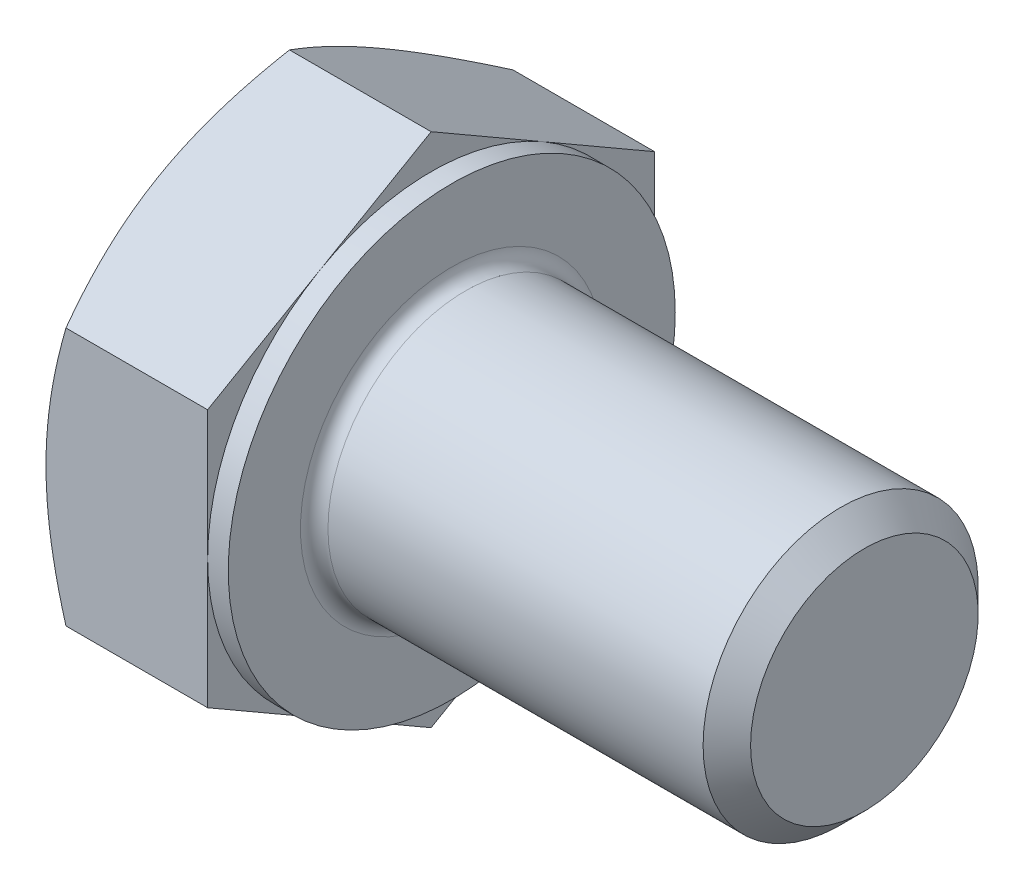
ISO-10303-21;
HEADER;
FILE_DESCRIPTION(('STEP AP214'),'2;1');
FILE_NAME('part.step','',(''),(''),'','','');
FILE_SCHEMA(('AUTOMOTIVE_DESIGN { 1 0 10303 214 1 1 1 1 }'));
ENDSEC;
DATA;
#1=APPLICATION_CONTEXT('core data for automotive mechanical design processes');
#2=APPLICATION_PROTOCOL_DEFINITION('international standard','automotive_design',2000,#1);
#3=PRODUCT_CONTEXT('',#1,'mechanical');
#4=PRODUCT('Part','Part','',(#3));
#5=PRODUCT_RELATED_PRODUCT_CATEGORY('part','',(#4));
#6=PRODUCT_DEFINITION_FORMATION('','',#4);
#7=PRODUCT_DEFINITION_CONTEXT('part definition',#1,'design');
#8=PRODUCT_DEFINITION('design','',#6,#7);
#9=PRODUCT_DEFINITION_SHAPE('','',#8);
#10=(LENGTH_UNIT() NAMED_UNIT(*) SI_UNIT(.MILLI.,.METRE.));
#11=(NAMED_UNIT(*) PLANE_ANGLE_UNIT() SI_UNIT($,.RADIAN.));
#12=(NAMED_UNIT(*) SI_UNIT($,.STERADIAN.) SOLID_ANGLE_UNIT());
#13=UNCERTAINTY_MEASURE_WITH_UNIT(LENGTH_MEASURE(1.E-05),#10,'distance_accuracy_value','');
#14=(GEOMETRIC_REPRESENTATION_CONTEXT(3) GLOBAL_UNCERTAINTY_ASSIGNED_CONTEXT((#13)) GLOBAL_UNIT_ASSIGNED_CONTEXT((#10,
#11,#12)) REPRESENTATION_CONTEXT('',''));
#15=CARTESIAN_POINT('',(0.,0.,0.));
#16=DIRECTION('',(0.,0.,1.));
#17=DIRECTION('',(1.,0.,0.));
#18=AXIS2_PLACEMENT_3D('',#15,#16,#17);
#19=CARTESIAN_POINT('',(5.3,7.50555349946514,0.));
#20=DIRECTION('',(1.,0.,0.));
#21=DIRECTION('',(0.,0.,-1.));
#22=AXIS2_PLACEMENT_3D('',#19,#20,#21);
#23=PLANE('',#22);
#24=CARTESIAN_POINT('',(5.3,0.,0.));
#25=DIRECTION('',(1.,0.,0.));
#26=DIRECTION('',(0.,0.,-1.));
#27=AXIS2_PLACEMENT_3D('',#24,#25,#26);
#28=CIRCLE('',#27,4.4);
#29=CARTESIAN_POINT('',(5.3,0.,-4.4));
#30=VERTEX_POINT('',#29);
#31=EDGE_CURVE('E48',#30,#30,#28,.F.);
#32=ORIENTED_EDGE('',*,*,#31,.T.);
#33=EDGE_LOOP('',(#32));
#34=FACE_BOUND('',#33,.T.);
#35=CARTESIAN_POINT('',(5.3,0.,0.));
#36=DIRECTION('',(1.,0.,0.));
#37=DIRECTION('',(0.,0.,-1.));
#38=AXIS2_PLACEMENT_3D('',#35,#36,#37);
#39=CIRCLE('',#38,6.5);
#40=CARTESIAN_POINT('',(5.3,0.,-6.5));
#41=VERTEX_POINT('',#40);
#42=EDGE_CURVE('E267',#41,#41,#39,.T.);
#43=ORIENTED_EDGE('',*,*,#42,.T.);
#44=EDGE_LOOP('',(#43));
#45=FACE_BOUND('',#44,.T.);
#46=ADVANCED_FACE('F39',(#34,#45),#23,.T.);
#47=CARTESIAN_POINT('',(0.,0.,0.));
#48=DIRECTION('',(-1.,0.,0.));
#49=DIRECTION('',(0.,0.,1.));
#50=AXIS2_PLACEMENT_3D('',#47,#48,#49);
#51=CYLINDRICAL_SURFACE('',#50,4.);
#52=CARTESIAN_POINT('',(5.7,0.,0.));
#53=DIRECTION('',(1.,0.,0.));
#54=DIRECTION('',(0.,0.,-1.));
#55=AXIS2_PLACEMENT_3D('',#52,#53,#54);
#56=CIRCLE('',#55,4.);
#57=CARTESIAN_POINT('',(5.7,0.,-4.));
#58=VERTEX_POINT('',#57);
#59=EDGE_CURVE('E11',#58,#58,#56,.T.);
#60=ORIENTED_EDGE('',*,*,#59,.T.);
#61=EDGE_LOOP('',(#60));
#62=FACE_BOUND('',#61,.T.);
#63=CARTESIAN_POINT('',(16.6095,0.,0.));
#64=DIRECTION('',(-1.,0.,0.));
#65=DIRECTION('',(0.,0.,1.));
#66=AXIS2_PLACEMENT_3D('',#63,#64,#65);
#67=CIRCLE('',#66,4.);
#68=CARTESIAN_POINT('',(16.6095,0.,4.));
#69=VERTEX_POINT('',#68);
#70=EDGE_CURVE('E311',#69,#69,#67,.T.);
#71=ORIENTED_EDGE('',*,*,#70,.T.);
#72=EDGE_LOOP('',(#71));
#73=FACE_BOUND('',#72,.T.);
#74=ADVANCED_FACE('F254',(#62,#73),#51,.T.);
#75=CARTESIAN_POINT('',(17.3,0.,0.));
#76=DIRECTION('',(-1.,0.,0.));
#77=DIRECTION('',(0.,0.,1.));
#78=AXIS2_PLACEMENT_3D('',#75,#76,#77);
#79=CONICAL_SURFACE('',#78,3.3095,0.785398163397463);
#80=ORIENTED_EDGE('',*,*,#70,.F.);
#81=EDGE_LOOP('',(#80));
#82=FACE_BOUND('',#81,.T.);
#83=CARTESIAN_POINT('',(17.3,0.,0.));
#84=DIRECTION('',(-1.,0.,0.));
#85=DIRECTION('',(0.,0.,1.));
#86=AXIS2_PLACEMENT_3D('',#83,#84,#85);
#87=CIRCLE('',#86,3.3095);
#88=CARTESIAN_POINT('',(17.3,0.,3.3095));
#89=VERTEX_POINT('',#88);
#90=EDGE_CURVE('E313',#89,#89,#87,.T.);
#91=ORIENTED_EDGE('',*,*,#90,.T.);
#92=EDGE_LOOP('',(#91));
#93=FACE_BOUND('',#92,.T.);
#94=ADVANCED_FACE('F259',(#82,#93),#79,.T.);
#95=CARTESIAN_POINT('',(17.3,0.,0.));
#96=DIRECTION('',(-1.,0.,0.));
#97=DIRECTION('',(0.,0.,1.));
#98=AXIS2_PLACEMENT_3D('',#95,#96,#97);
#99=PLANE('',#98);
#100=ORIENTED_EDGE('',*,*,#90,.F.);
#101=EDGE_LOOP('',(#100));
#102=FACE_BOUND('',#101,.T.);
#103=ADVANCED_FACE('F360',(#102),#99,.F.);
#104=CARTESIAN_POINT('',(4.7,6.5,0.));
#105=DIRECTION('',(1.,0.,0.));
#106=DIRECTION('',(0.,0.,-1.));
#107=AXIS2_PLACEMENT_3D('',#104,#105,#106);
#108=PLANE('',#107);
#109=DIRECTION('',(0.,0.500000000000001,0.866025403784438));
#110=VECTOR('',#109,1.);
#111=CARTESIAN_POINT('',(4.7,3.75277674973256,-6.5));
#112=LINE('',#111,#110);
#113=CARTESIAN_POINT('',(4.7,3.75277674973256,-6.5));
#114=VERTEX_POINT('',#113);
#115=CARTESIAN_POINT('',(4.7,5.62916512459885,-3.25));
#116=VERTEX_POINT('',#115);
#117=EDGE_CURVE('E172',#114,#116,#112,.T.);
#118=ORIENTED_EDGE('',*,*,#117,.T.);
#119=CARTESIAN_POINT('',(4.7,0.,0.));
#120=DIRECTION('',(-1.,0.,0.));
#121=DIRECTION('',(0.,0.,1.));
#122=AXIS2_PLACEMENT_3D('',#119,#120,#121);
#123=CIRCLE('',#122,6.5);
#124=CARTESIAN_POINT('',(4.7,0.,-6.5));
#125=VERTEX_POINT('',#124);
#126=EDGE_CURVE('E55',#116,#125,#123,.T.);
#127=ORIENTED_EDGE('',*,*,#126,.T.);
#128=DIRECTION('',(0.,1.,0.));
#129=VECTOR('',#128,1.);
#130=CARTESIAN_POINT('',(4.7,3.75277674973256,-6.5));
#131=LINE('',#130,#129);
#132=EDGE_CURVE('E268',#125,#114,#131,.T.);
#133=ORIENTED_EDGE('',*,*,#132,.T.);
#134=EDGE_LOOP('',(#118,#127,#133));
#135=FACE_BOUND('',#134,.T.);
#136=ADVANCED_FACE('F290',(#135),#108,.T.);
#137=CARTESIAN_POINT('',(4.7,7.50555349946514,0.));
#138=VERTEX_POINT('',#137);
#139=EDGE_CURVE('E170',#116,#138,#112,.T.);
#140=ORIENTED_EDGE('',*,*,#139,.T.);
#141=DIRECTION('',(0.,-0.500000000000001,0.866025403784438));
#142=VECTOR('',#141,1.);
#143=CARTESIAN_POINT('',(4.7,7.50555349946514,0.));
#144=LINE('',#143,#142);
#145=CARTESIAN_POINT('',(4.7,5.62916512459885,3.25));
#146=VERTEX_POINT('',#145);
#147=EDGE_CURVE('E169',#138,#146,#144,.T.);
#148=ORIENTED_EDGE('',*,*,#147,.T.);
#149=EDGE_CURVE('E158',#146,#116,#123,.T.);
#150=ORIENTED_EDGE('',*,*,#149,.T.);
#151=EDGE_LOOP('',(#140,#148,#150));
#152=FACE_BOUND('',#151,.T.);
#153=ADVANCED_FACE('F297',(#152),#108,.T.);
#154=CARTESIAN_POINT('',(4.7,3.75277674973257,6.5));
#155=VERTEX_POINT('',#154);
#156=EDGE_CURVE('E137',#146,#155,#144,.T.);
#157=ORIENTED_EDGE('',*,*,#156,.T.);
#158=DIRECTION('',(0.,-1.,0.));
#159=VECTOR('',#158,1.);
#160=CARTESIAN_POINT('',(4.7,3.75277674973257,6.5));
#161=LINE('',#160,#159);
#162=CARTESIAN_POINT('',(4.7,0.,6.5));
#163=VERTEX_POINT('',#162);
#164=EDGE_CURVE('E131',#155,#163,#161,.T.);
#165=ORIENTED_EDGE('',*,*,#164,.T.);
#166=EDGE_CURVE('E135',#163,#146,#123,.T.);
#167=ORIENTED_EDGE('',*,*,#166,.T.);
#168=EDGE_LOOP('',(#157,#165,#167));
#169=FACE_BOUND('',#168,.T.);
#170=ADVANCED_FACE('F133',(#169),#108,.T.);
#171=CARTESIAN_POINT('',(4.7,-3.75277674973257,6.5));
#172=VERTEX_POINT('',#171);
#173=EDGE_CURVE('E141',#163,#172,#161,.T.);
#174=ORIENTED_EDGE('',*,*,#173,.T.);
#175=DIRECTION('',(0.,-0.500000000000001,-0.866025403784438));
#176=VECTOR('',#175,1.);
#177=CARTESIAN_POINT('',(4.7,-7.50555349946515,0.));
#178=LINE('',#177,#176);
#179=CARTESIAN_POINT('',(4.7,-5.62916512459885,3.25000000000001));
#180=VERTEX_POINT('',#179);
#181=EDGE_CURVE('E148',#172,#180,#178,.T.);
#182=ORIENTED_EDGE('',*,*,#181,.T.);
#183=EDGE_CURVE('E145',#180,#163,#123,.T.);
#184=ORIENTED_EDGE('',*,*,#183,.T.);
#185=EDGE_LOOP('',(#174,#182,#184));
#186=FACE_BOUND('',#185,.T.);
#187=ADVANCED_FACE('F146',(#186),#108,.T.);
#188=CARTESIAN_POINT('',(4.7,-7.50555349946515,0.));
#189=VERTEX_POINT('',#188);
#190=EDGE_CURVE('E164',#180,#189,#178,.T.);
#191=ORIENTED_EDGE('',*,*,#190,.T.);
#192=DIRECTION('',(0.,0.5,-0.866025403784438));
#193=VECTOR('',#192,1.);
#194=CARTESIAN_POINT('',(4.7,-3.75277674973257,-6.5));
#195=LINE('',#194,#193);
#196=CARTESIAN_POINT('',(4.7,-5.62916512459885,-3.25));
#197=VERTEX_POINT('',#196);
#198=EDGE_CURVE('E351',#189,#197,#195,.T.);
#199=ORIENTED_EDGE('',*,*,#198,.T.);
#200=EDGE_CURVE('E152',#197,#180,#123,.T.);
#201=ORIENTED_EDGE('',*,*,#200,.T.);
#202=EDGE_LOOP('',(#191,#199,#201));
#203=FACE_BOUND('',#202,.T.);
#204=ADVANCED_FACE('F352',(#203),#108,.T.);
#205=CARTESIAN_POINT('',(4.7,-3.75277674973257,-6.5));
#206=VERTEX_POINT('',#205);
#207=EDGE_CURVE('E159',#197,#206,#195,.T.);
#208=ORIENTED_EDGE('',*,*,#207,.T.);
#209=EDGE_CURVE('E271',#206,#125,#131,.T.);
#210=ORIENTED_EDGE('',*,*,#209,.T.);
#211=EDGE_CURVE('E283',#125,#197,#123,.T.);
#212=ORIENTED_EDGE('',*,*,#211,.T.);
#213=EDGE_LOOP('',(#208,#210,#212));
#214=FACE_BOUND('',#213,.T.);
#215=ADVANCED_FACE('F282',(#214),#108,.T.);
#216=CARTESIAN_POINT('',(0.,0.,0.));
#217=DIRECTION('',(-1.,0.,0.));
#218=DIRECTION('',(0.,0.,1.));
#219=AXIS2_PLACEMENT_3D('',#216,#217,#218);
#220=CYLINDRICAL_SURFACE('',#219,6.5);
#221=ORIENTED_EDGE('',*,*,#126,.F.);
#222=ORIENTED_EDGE('',*,*,#149,.F.);
#223=ORIENTED_EDGE('',*,*,#166,.F.);
#224=ORIENTED_EDGE('',*,*,#183,.F.);
#225=ORIENTED_EDGE('',*,*,#200,.F.);
#226=ORIENTED_EDGE('',*,*,#211,.F.);
#227=EDGE_LOOP('',(#221,#222,#223,#224,#225,#226));
#228=FACE_BOUND('',#227,.T.);
#229=ORIENTED_EDGE('',*,*,#42,.F.);
#230=EDGE_LOOP('',(#229));
#231=FACE_BOUND('',#230,.T.);
#232=ADVANCED_FACE('F155',(#228,#231),#220,.T.);
#233=CARTESIAN_POINT('',(0.,7.50555349946514,0.));
#234=DIRECTION('',(1.,0.,0.));
#235=DIRECTION('',(0.,0.,-1.));
#236=AXIS2_PLACEMENT_3D('',#233,#234,#235);
#237=PLANE('',#236);
#238=CARTESIAN_POINT('',(0.,0.,0.));
#239=DIRECTION('',(1.,0.,0.));
#240=DIRECTION('',(0.,0.,-1.));
#241=AXIS2_PLACEMENT_3D('',#238,#239,#240);
#242=CIRCLE('',#241,6.5);
#243=CARTESIAN_POINT('',(0.,0.,-6.5));
#244=VERTEX_POINT('',#243);
#245=CARTESIAN_POINT('',(0.,5.62916512459885,-3.25000000000001));
#246=VERTEX_POINT('',#245);
#247=EDGE_CURVE('E269',#244,#246,#242,.T.);
#248=ORIENTED_EDGE('',*,*,#247,.F.);
#249=CARTESIAN_POINT('',(0.,-5.62916512459885,-3.25));
#250=VERTEX_POINT('',#249);
#251=EDGE_CURVE('E275',#250,#244,#242,.T.);
#252=ORIENTED_EDGE('',*,*,#251,.F.);
#253=CARTESIAN_POINT('',(0.,-5.62916512459885,3.25000000000001));
#254=VERTEX_POINT('',#253);
#255=EDGE_CURVE('E333',#254,#250,#242,.T.);
#256=ORIENTED_EDGE('',*,*,#255,.F.);
#257=CARTESIAN_POINT('',(0.,0.,6.5));
#258=VERTEX_POINT('',#257);
#259=EDGE_CURVE('E329',#258,#254,#242,.T.);
#260=ORIENTED_EDGE('',*,*,#259,.F.);
#261=CARTESIAN_POINT('',(0.,0.,0.));
#262=DIRECTION('',(-1.,0.,0.));
#263=DIRECTION('',(0.,0.,1.));
#264=AXIS2_PLACEMENT_3D('',#261,#262,#263);
#265=CIRCLE('',#264,6.5);
#266=CARTESIAN_POINT('',(0.,5.62916512459885,3.25));
#267=VERTEX_POINT('',#266);
#268=EDGE_CURVE('E173',#258,#267,#265,.T.);
#269=ORIENTED_EDGE('',*,*,#268,.T.);
#270=EDGE_CURVE('E273',#246,#267,#242,.T.);
#271=ORIENTED_EDGE('',*,*,#270,.F.);
#272=EDGE_LOOP('',(#248,#252,#256,#260,#269,#271));
#273=FACE_BOUND('',#272,.T.);
#274=ADVANCED_FACE('F330',(#273),#237,.F.);
#275=CARTESIAN_POINT('',(0.,0.,0.));
#276=DIRECTION('',(1.,0.,0.));
#277=DIRECTION('',(0.,0.,-1.));
#278=AXIS2_PLACEMENT_3D('',#275,#276,#277);
#279=CONICAL_SURFACE('',#278,6.5,1.0471975511966);
#280=CARTESIAN_POINT('',(0.580623251805861,3.75266127967873,6.5002));
#281=CARTESIAN_POINT('',(0.53300442307548,3.8351516191275,6.35732254094112));
#282=CARTESIAN_POINT('',(0.487546700602701,3.91794952254312,6.21391236546509));
#283=CARTESIAN_POINT('',(0.401548682023042,4.08421773795794,5.9259273686828));
#284=CARTESIAN_POINT('',(0.361010507228022,4.16768832359105,5.78135207342874));
#285=CARTESIAN_POINT('',(0.247571001123207,4.41943655294051,5.34531134947997));
#286=CARTESIAN_POINT('',(0.183047807128738,4.58870793403689,5.05212471715368));
#287=CARTESIAN_POINT('',(0.107386583547491,4.84201947708215,4.61337625445563));
#288=CARTESIAN_POINT('',(0.0858328564569874,4.92530276780316,4.46912536350531));
#289=CARTESIAN_POINT('',(0.0496903146061193,5.09224566542477,4.17997178286191));
#290=CARTESIAN_POINT('',(0.0351008844596669,5.17590523841627,4.03506915190111));
#291=CARTESIAN_POINT('',(0.0132587525073473,5.34336968579964,3.74501222057168));
#292=CARTESIAN_POINT('',(0.0059977243221085,5.427174286676,3.59985839394579));
#293=CARTESIAN_POINT('',(-0.00103969741776754,5.59485627940483,3.30942466302506));
#294=CARTESIAN_POINT('',(-0.000816322187794126,5.6787336689286,3.16414476276365));
#295=CARTESIAN_POINT('',(0.0100834585151664,5.90853103021317,2.76612405757351));
#296=CARTESIAN_POINT('',(0.0283818178694138,6.05437578112763,2.51351353897243));
#297=CARTESIAN_POINT('',(0.086406341457675,6.34509659313135,2.00997032176432));
#298=CARTESIAN_POINT('',(0.126152338538245,6.48997163178545,1.75903939406692));
#299=CARTESIAN_POINT('',(0.225505903202149,6.78127752911039,1.25448277935568));
#300=CARTESIAN_POINT('',(0.285534425638026,6.92767163007068,1.00092075856409));
#301=CARTESIAN_POINT('',(0.421774992509867,7.21827667013277,0.497578064240956));
#302=CARTESIAN_POINT('',(0.497955034163591,7.36249133098589,0.247790944447036));
#303=CARTESIAN_POINT('',(0.580623251805865,7.50566896951898,-0.000200000000000185));
#304=B_SPLINE_CURVE_WITH_KNOTS('',3,(#280,#281,#282,#283,#284,#285,#286,#287,#288,#289,#290,
#291,#292,#293,#294,#295,#296,#297,#298,#299,#300,#301,#302,#303),.UNSPECIFIED.,.F.,.F.,(4,2,2,
2,2,2,2,2,2,2,2,4),(0.,0.515105052395587,1.03043143507524,2.06322554824262,2.56697389547996,
3.07067772176453,3.57380860368927,4.07692394242519,4.9527935470566,5.82947446853466,
6.72559912449736,7.61996451221046),.UNSPECIFIED.);
#305=CARTESIAN_POINT('',(0.580556583600761,7.50555349946514,0.));
#306=VERTEX_POINT('',#305);
#307=EDGE_CURVE('E222',#267,#306,#304,.T.);
#308=ORIENTED_EDGE('',*,*,#307,.T.);
#309=CARTESIAN_POINT('',(0.580623251805865,7.50566896951898,0.000199999999999942));
#310=CARTESIAN_POINT('',(0.533004423075484,7.4231786300702,-0.14267745905888));
#311=CARTESIAN_POINT('',(0.487546700602705,7.34038072665458,-0.286087634534912));
#312=CARTESIAN_POINT('',(0.401548682023045,7.17411251123976,-0.574072631317194));
#313=CARTESIAN_POINT('',(0.361010507228024,7.09064192560665,-0.718647926571263));
#314=CARTESIAN_POINT('',(0.247571001123208,6.83889369625719,-1.15468865052003));
#315=CARTESIAN_POINT('',(0.18304780712874,6.66962231516081,-1.44787528284632));
#316=CARTESIAN_POINT('',(0.107386583547492,6.41631077211555,-1.88662374554437));
#317=CARTESIAN_POINT('',(0.0858328564569881,6.33302748139454,-2.03087463649469));
#318=CARTESIAN_POINT('',(0.0496903146061196,6.16608458377293,-2.32002821713809));
#319=CARTESIAN_POINT('',(0.0351008844596673,6.08242501078143,-2.46493084809889));
#320=CARTESIAN_POINT('',(0.0132587525073475,5.91496056339807,-2.75498777942832));
#321=CARTESIAN_POINT('',(0.00599772432210842,5.8311559625217,-2.90014160605421));
#322=CARTESIAN_POINT('',(-0.00103969741776819,5.66347396979287,-3.19057533697495));
#323=CARTESIAN_POINT('',(-0.000816322187795032,5.5795965802691,-3.33585523723635));
#324=CARTESIAN_POINT('',(0.0100834585151652,5.34979921898453,-3.73387594242649));
#325=CARTESIAN_POINT('',(0.0283818178694129,5.20395446807007,-3.98648646102757));
#326=CARTESIAN_POINT('',(0.0864063414576737,4.91323365606636,-4.49002967823568));
#327=CARTESIAN_POINT('',(0.126152338538243,4.76835861741226,-4.74096060593308));
#328=CARTESIAN_POINT('',(0.225505903202146,4.47705272008732,-5.24551722064432));
#329=CARTESIAN_POINT('',(0.285534425638022,4.33065861912702,-5.49907924143591));
#330=CARTESIAN_POINT('',(0.421774992509863,4.04005357906493,-6.00242193575904));
#331=CARTESIAN_POINT('',(0.497955034163587,3.89583891821181,-6.25220905555296));
#332=CARTESIAN_POINT('',(0.580623251805861,3.75266127967873,-6.5002));
#333=B_SPLINE_CURVE_WITH_KNOTS('',3,(#309,#310,#311,#312,#313,#314,#315,#316,#317,#318,#319,
#320,#321,#322,#323,#324,#325,#326,#327,#328,#329,#330,#331,#332),.UNSPECIFIED.,.F.,.F.,(4,2,2,
2,2,2,2,2,2,2,2,4),(0.,0.515105052395587,1.03043143507524,2.06322554824262,2.56697389547996,
3.07067772176453,3.57380860368928,4.0769239424252,4.9527935470566,5.82947446853466,
6.72559912449736,7.61996451221046),.UNSPECIFIED.);
#334=EDGE_CURVE('E63',#306,#246,#333,.T.);
#335=ORIENTED_EDGE('',*,*,#334,.T.);
#336=ORIENTED_EDGE('',*,*,#270,.T.);
#337=EDGE_LOOP('',(#308,#335,#336));
#338=FACE_BOUND('',#337,.T.);
#339=ADVANCED_FACE('F327',(#338),#279,.T.);
#340=CARTESIAN_POINT('',(3.18835311563216,-10.1137456673369,6.5));
#341=CARTESIAN_POINT('',(3.05034773984569,-9.82952666268363,6.5));
#342=CARTESIAN_POINT('',(2.91365616465169,-9.54465869597371,6.5));
#343=CARTESIAN_POINT('',(2.64363899475027,-8.9732797800977,6.5));
#344=CARTESIAN_POINT('',(2.51031392437707,-8.68676858342199,6.5));
#345=CARTESIAN_POINT('',(2.24710473463579,-8.11029837800201,6.5));
#346=CARTESIAN_POINT('',(2.11724300420665,-7.82032911160932,6.5));
#347=CARTESIAN_POINT('',(1.8627908281112,-7.23809540985589,6.5));
#348=CARTESIAN_POINT('',(1.73820013539997,-6.94583108282378,6.5));
#349=CARTESIAN_POINT('',(1.49176685414525,-6.34906440932191,6.5));
#350=CARTESIAN_POINT('',(1.37014257629961,-6.04447142260091,6.5));
#351=CARTESIAN_POINT('',(1.13601865749048,-5.43173420932697,6.5));
#352=CARTESIAN_POINT('',(1.02352003549992,-5.12358959057326,6.5));
#353=CARTESIAN_POINT('',(0.810575368179996,-4.50382569763974,6.5));
#354=CARTESIAN_POINT('',(0.71010523225176,-4.19221478250845,6.5));
#355=CARTESIAN_POINT('',(0.524420166111963,-3.56452019194196,6.5));
#356=CARTESIAN_POINT('',(0.439200468182006,-3.248437947833,6.5));
#357=CARTESIAN_POINT('',(0.288524223393067,-2.61335465708694,6.5));
#358=CARTESIAN_POINT('',(0.22296186574418,-2.29437912058767,6.5));
#359=CARTESIAN_POINT('',(0.115312883140192,-1.65238219411908,6.5));
#360=CARTESIAN_POINT('',(0.0732239014810092,-1.32936121363907,6.5));
#361=CARTESIAN_POINT('',(0.0304887136492793,-0.845231171985981,6.5));
#362=CARTESIAN_POINT('',(0.0196493434374818,-0.684982209825929,6.5));
#363=CARTESIAN_POINT('',(0.00475298486802839,-0.364162349261911,6.5));
#364=CARTESIAN_POINT('',(0.000695882912926891,-0.203591456295124,6.5));
#365=CARTESIAN_POINT('',(-0.000531597192431542,0.117577430127593,6.5));
#366=CARTESIAN_POINT('',(0.00229809016385244,0.278175423826775,6.5));
#367=CARTESIAN_POINT('',(0.0147726845392768,0.599108972527027,6.5));
#368=CARTESIAN_POINT('',(0.0244179260292899,0.759444514261294,6.5));
#369=CARTESIAN_POINT('',(0.0554961939005601,1.1436994656868,6.5));
#370=CARTESIAN_POINT('',(0.0801030490102252,1.36736763010324,6.5));
#371=CARTESIAN_POINT('',(0.141246537396775,1.81305591275148,6.5));
#372=CARTESIAN_POINT('',(0.177784759549959,2.035075807457,6.5));
#373=CARTESIAN_POINT('',(0.303360001243783,2.69839633393827,6.5));
#374=CARTESIAN_POINT('',(0.408335815043154,3.13672010332748,6.5));
#375=CARTESIAN_POINT('',(0.590564593006713,3.79232112874054,6.5));
#376=CARTESIAN_POINT('',(0.65631319884288,4.01299150829173,6.5));
#377=CARTESIAN_POINT('',(0.794681634048787,4.45218858961829,6.5));
#378=CARTESIAN_POINT('',(0.867301512962924,4.67071527592431,6.5));
#379=CARTESIAN_POINT('',(1.01824353836803,5.10569490203691,6.5));
#380=CARTESIAN_POINT('',(1.09656388214599,5.3221484731522,6.5));
#381=CARTESIAN_POINT('',(1.25798086145111,5.75325725721542,6.5));
#382=CARTESIAN_POINT('',(1.34107741015563,5.96791250277239,6.5));
#383=CARTESIAN_POINT('',(1.56029019561416,6.51888445883546,6.5));
#384=CARTESIAN_POINT('',(1.69936356644503,6.85402316761092,6.5));
#385=CARTESIAN_POINT('',(1.98501958064622,7.52109583887404,6.5));
#386=CARTESIAN_POINT('',(2.13160288757765,7.85302951508199,6.5));
#387=CARTESIAN_POINT('',(2.43059748021416,8.51437865467408,6.5));
#388=CARTESIAN_POINT('',(2.5830105757321,8.84379329733072,6.5));
#389=CARTESIAN_POINT('',(2.89234869350807,9.50047798633195,6.5));
#390=CARTESIAN_POINT('',(3.04927357195784,9.82774810062372,6.5));
#391=CARTESIAN_POINT('',(3.366920131061,10.4809971970749,6.5));
#392=CARTESIAN_POINT('',(3.5276467646709,10.8069737662429,6.5));
#393=CARTESIAN_POINT('',(3.85198555530078,11.4574882896093,6.5));
#394=CARTESIAN_POINT('',(4.01559773098171,11.7820262344869,6.5));
#395=CARTESIAN_POINT('',(4.50986184978696,12.753746810957,6.5));
#396=CARTESIAN_POINT('',(4.84399997953391,13.3991555927631,6.5));
#397=CARTESIAN_POINT('',(5.48575990240554,14.6239779286089,6.5));
#398=CARTESIAN_POINT('',(5.79279643346762,15.20369957558,6.5));
#399=CARTESIAN_POINT('',(6.41069188201843,16.3611382633071,6.5));
#400=CARTESIAN_POINT('',(6.72155098984202,16.9388552023926,6.5));
#401=CARTESIAN_POINT('',(7.34519775412865,18.0910273551188,6.5));
#402=CARTESIAN_POINT('',(7.65797694142592,18.6654871601314,6.5));
#403=CARTESIAN_POINT('',(8.28574397126577,19.8131486199609,6.5));
#404=CARTESIAN_POINT('',(8.6007316626767,20.3863503574121,6.5));
#405=CARTESIAN_POINT('',(8.91652967142029,20.9591024516606,6.5));
#406=B_SPLINE_CURVE_WITH_KNOTS('',3,(#340,#341,#342,#343,#344,#345,#346,#347,#348,#349,#350,
#351,#352,#353,#354,#355,#356,#357,#358,#359,#360,#361,#362,#363,#364,#365,#366,#367,#368,#369,
#370,#371,#372,#373,#374,#375,#376,#377,#378,#379,#380,#381,#382,#383,#384,#385,#386,#387,#388,
#389,#390,#391,#392,#393,#394,#395,#396,#397,#398,#399,#400,#401,#402,#403,#404,#405),
.UNSPECIFIED.,.F.,.F.,(4,2,2,2,2,2,2,2,2,2,2,2,2,2,2,2,2,2,2,2,2,2,2,2,2,2,2,2,2,2,2,2,4),(0.,
0.947868666637001,1.89588406470428,2.84900320910869,3.80207763278045,4.7858977404943,
5.76982755101459,6.75175256199403,7.73337005710129,8.70960474826444,9.68574140876309,
10.1674651045585,10.6491807317952,11.1309009410869,11.612644792267,12.2873175714037,
12.9620802320305,14.3123184370259,15.0030310333297,15.6937486103039,16.3842486961975,
17.074736234034,18.1631508671878,19.2516618366358,20.3405135130783,21.4293305219254,
22.519654053591,23.6099846390269,25.7902468223405,27.7582608860787,29.7263733417655,
31.6886408583916,33.6507753794604),.UNSPECIFIED.);
#407=CARTESIAN_POINT('',(0.580556583600757,3.75277674973256,6.5));
#408=VERTEX_POINT('',#407);
#409=EDGE_CURVE('E236',#258,#408,#406,.T.);
#410=ORIENTED_EDGE('',*,*,#409,.T.);
#411=EDGE_CURVE('E235',#408,#267,#304,.T.);
#412=ORIENTED_EDGE('',*,*,#411,.T.);
#413=ORIENTED_EDGE('',*,*,#268,.F.);
#414=EDGE_LOOP('',(#410,#412,#413));
#415=FACE_BOUND('',#414,.T.);
#416=ADVANCED_FACE('F324',(#415),#279,.T.);
#417=CARTESIAN_POINT('',(0.580556583600758,-3.75277674973257,6.5));
#418=VERTEX_POINT('',#417);
#419=EDGE_CURVE('E315',#418,#258,#406,.T.);
#420=ORIENTED_EDGE('',*,*,#419,.T.);
#421=ORIENTED_EDGE('',*,*,#259,.T.);
#422=CARTESIAN_POINT('',(0.580623251805869,-7.50566896951898,-0.000199999999999312));
#423=CARTESIAN_POINT('',(0.533004423075487,-7.42317863007021,0.142677459058881));
#424=CARTESIAN_POINT('',(0.487546700602708,-7.34038072665459,0.286087634534913));
#425=CARTESIAN_POINT('',(0.401548682023049,-7.17411251123977,0.574072631317195));
#426=CARTESIAN_POINT('',(0.361010507228029,-7.09064192560666,0.718647926571265));
#427=CARTESIAN_POINT('',(0.247571001123213,-6.8388936962572,1.15468865052003));
#428=CARTESIAN_POINT('',(0.183047807128744,-6.66962231516082,1.44787528284632));
#429=CARTESIAN_POINT('',(0.107386583547496,-6.41631077211556,1.88662374554437));
#430=CARTESIAN_POINT('',(0.0858328564569919,-6.33302748139455,2.03087463649469));
#431=CARTESIAN_POINT('',(0.0496903146061238,-6.16608458377294,2.32002821713809));
#432=CARTESIAN_POINT('',(0.0351008844596716,-6.08242501078144,2.46493084809889));
#433=CARTESIAN_POINT('',(0.0132587525073517,-5.91496056339807,2.75498777942832));
#434=CARTESIAN_POINT('',(0.00599772432211233,-5.83115596252171,2.90014160605421));
#435=CARTESIAN_POINT('',(-0.00103969741776435,-5.66347396979287,3.19057533697495));
#436=CARTESIAN_POINT('',(-0.000816322187790917,-5.57959658026911,3.33585523723636));
#437=CARTESIAN_POINT('',(0.0100834585151693,-5.34979921898454,3.73387594242649));
#438=CARTESIAN_POINT('',(0.0283818178694163,-5.20395446807007,3.98648646102757));
#439=CARTESIAN_POINT('',(0.0864063414576766,-4.91323365606636,4.49002967823568));
#440=CARTESIAN_POINT('',(0.126152338538246,-4.76835861741226,4.74096060593308));
#441=CARTESIAN_POINT('',(0.225505903202149,-4.47705272008732,5.24551722064432));
#442=CARTESIAN_POINT('',(0.285534425638026,-4.33065861912703,5.49907924143591));
#443=CARTESIAN_POINT('',(0.421774992509866,-4.04005357906494,6.00242193575904));
#444=CARTESIAN_POINT('',(0.497955034163589,-3.89583891821182,6.25220905555296));
#445=CARTESIAN_POINT('',(0.580623251805863,-3.75266127967873,6.5002));
#446=B_SPLINE_CURVE_WITH_KNOTS('',3,(#422,#423,#424,#425,#426,#427,#428,#429,#430,#431,#432,
#433,#434,#435,#436,#437,#438,#439,#440,#441,#442,#443,#444,#445),.UNSPECIFIED.,.F.,.F.,(4,2,2,
2,2,2,2,2,2,2,2,4),(0.,0.515105052395588,1.03043143507525,2.06322554824262,2.56697389547997,
3.07067772176454,3.57380860368928,4.0769239424252,4.9527935470566,5.82947446853467,
6.72559912449736,7.61996451221046),.UNSPECIFIED.);
#447=EDGE_CURVE('E224',#254,#418,#446,.T.);
#448=ORIENTED_EDGE('',*,*,#447,.T.);
#449=EDGE_LOOP('',(#420,#421,#448));
#450=FACE_BOUND('',#449,.T.);
#451=ADVANCED_FACE('F193',(#450),#279,.T.);
#452=CARTESIAN_POINT('',(0.580556583600765,-7.50555349946515,0.));
#453=VERTEX_POINT('',#452);
#454=EDGE_CURVE('E216',#453,#254,#446,.T.);
#455=ORIENTED_EDGE('',*,*,#454,.T.);
#456=ORIENTED_EDGE('',*,*,#255,.T.);
#457=CARTESIAN_POINT('',(0.580623251805865,-3.75266127967874,-6.5002));
#458=CARTESIAN_POINT('',(0.533004423075483,-3.83515161912751,-6.35732254094112));
#459=CARTESIAN_POINT('',(0.487546700602705,-3.91794952254313,-6.21391236546509));
#460=CARTESIAN_POINT('',(0.401548682023045,-4.08421773795795,-5.92592736868281));
#461=CARTESIAN_POINT('',(0.361010507228025,-4.16768832359106,-5.78135207342874));
#462=CARTESIAN_POINT('',(0.24757100112321,-4.41943655294052,-5.34531134947997));
#463=CARTESIAN_POINT('',(0.183047807128741,-4.5887079340369,-5.05212471715368));
#464=CARTESIAN_POINT('',(0.107386583547495,-4.84201947708216,-4.61337625445563));
#465=CARTESIAN_POINT('',(0.0858328564569908,-4.92530276780317,-4.46912536350531));
#466=CARTESIAN_POINT('',(0.0496903146061231,-5.09224566542478,-4.17997178286191));
#467=CARTESIAN_POINT('',(0.0351008844596713,-5.17590523841628,-4.03506915190111));
#468=CARTESIAN_POINT('',(0.0132587525073519,-5.34336968579964,-3.74501222057168));
#469=CARTESIAN_POINT('',(0.00599772432211273,-5.42717428667601,-3.59985839394579));
#470=CARTESIAN_POINT('',(-0.00103969741776374,-5.59485627940484,-3.30942466302505));
#471=CARTESIAN_POINT('',(-0.000816322187790392,-5.67873366892861,-3.16414476276364));
#472=CARTESIAN_POINT('',(0.0100834585151705,-5.90853103021318,-2.76612405757351));
#473=CARTESIAN_POINT('',(0.0283818178694188,-6.05437578112764,-2.51351353897243));
#474=CARTESIAN_POINT('',(0.0864063414576805,-6.34509659313135,-2.00997032176432));
#475=CARTESIAN_POINT('',(0.12615233853825,-6.48997163178545,-1.75903939406692));
#476=CARTESIAN_POINT('',(0.225505903202154,-6.78127752911039,-1.25448277935568));
#477=CARTESIAN_POINT('',(0.28553442563803,-6.92767163007069,-1.00092075856409));
#478=CARTESIAN_POINT('',(0.421774992509871,-7.21827667013278,-0.497578064240956));
#479=CARTESIAN_POINT('',(0.497955034163595,-7.3624913309859,-0.247790944447036));
#480=CARTESIAN_POINT('',(0.580623251805869,-7.50566896951898,0.000199999999999799));
#481=B_SPLINE_CURVE_WITH_KNOTS('',3,(#457,#458,#459,#460,#461,#462,#463,#464,#465,#466,#467,
#468,#469,#470,#471,#472,#473,#474,#475,#476,#477,#478,#479,#480),.UNSPECIFIED.,.F.,.F.,(4,2,2,
2,2,2,2,2,2,2,2,4),(0.,0.515105052395587,1.03043143507524,2.06322554824262,2.56697389547996,
3.07067772176453,3.57380860368927,4.0769239424252,4.9527935470566,5.82947446853466,
6.72559912449736,7.61996451221046),.UNSPECIFIED.);
#482=EDGE_CURVE('E223',#250,#453,#481,.T.);
#483=ORIENTED_EDGE('',*,*,#482,.T.);
#484=EDGE_LOOP('',(#455,#456,#483));
#485=FACE_BOUND('',#484,.T.);
#486=ADVANCED_FACE('F347',(#485),#279,.T.);
#487=CARTESIAN_POINT('',(0.580556583600757,3.75277674973256,-6.5));
#488=VERTEX_POINT('',#487);
#489=EDGE_CURVE('E225',#246,#488,#333,.T.);
#490=ORIENTED_EDGE('',*,*,#489,.T.);
#491=CARTESIAN_POINT('',(3.18835311590243,-10.1137456678934,-6.5));
#492=CARTESIAN_POINT('',(3.05034774010466,-9.82952666322138,-6.5));
#493=CARTESIAN_POINT('',(2.91365616489936,-9.54465869649273,-6.5));
#494=CARTESIAN_POINT('',(2.64363899497539,-8.97327978057921,-6.5));
#495=CARTESIAN_POINT('',(2.51031392459094,-8.68676858388472,-6.5));
#496=CARTESIAN_POINT('',(2.24710473482717,-8.11029837842688,-6.5));
#497=CARTESIAN_POINT('',(2.11724300438678,-7.82032911201511,-6.5));
#498=CARTESIAN_POINT('',(1.86279082826901,-7.23809541022339,-6.5));
#499=CARTESIAN_POINT('',(1.73820013554673,-6.94583108317207,-6.5));
#500=CARTESIAN_POINT('',(1.4917668542696,-6.34906440963036,-6.5));
#501=CARTESIAN_POINT('',(1.37014257641264,-6.04447142288872,-6.5));
#502=CARTESIAN_POINT('',(1.13601865758148,-5.43173420957315,-6.5));
#503=CARTESIAN_POINT('',(1.02352003558021,-5.12358959079846,-6.5));
#504=CARTESIAN_POINT('',(0.810575368239911,-4.50382569782259,-6.5));
#505=CARTESIAN_POINT('',(0.710105232302,-4.19221478266993,-6.5));
#506=CARTESIAN_POINT('',(0.52442016614445,-3.56452019206012,-6.5));
#507=CARTESIAN_POINT('',(0.439200468206415,-3.24843794792921,-6.5));
#508=CARTESIAN_POINT('',(0.288524223401196,-2.61335465712783,-6.5));
#509=CARTESIAN_POINT('',(0.222961865744747,-2.29437912059505,-6.5));
#510=CARTESIAN_POINT('',(0.115312883130725,-1.65238219405862,-6.5));
#511=CARTESIAN_POINT('',(0.0732239014690635,-1.3293612135443,-6.5));
#512=CARTESIAN_POINT('',(0.0304887136381669,-0.845231171839984,-6.5));
#513=CARTESIAN_POINT('',(0.0196493434273847,-0.684982209663102,-6.5));
#514=CARTESIAN_POINT('',(0.00475298486144082,-0.36416234906546,-6.5));
#515=CARTESIAN_POINT('',(0.000695882908833378,-0.203591456081879,-6.5));
#516=CARTESIAN_POINT('',(-0.000531597190093827,0.117577430374297,-6.5));
#517=CARTESIAN_POINT('',(0.00229809017012765,0.278175424090143,-6.5));
#518=CARTESIAN_POINT('',(0.0147726845547645,0.599108972823506,-6.5));
#519=CARTESIAN_POINT('',(0.0244179260500527,0.759444514574217,-6.5));
#520=CARTESIAN_POINT('',(0.0554961939343012,1.14369946602534,-6.5));
#521=CARTESIAN_POINT('',(0.0801030490514527,1.36736763045086,-6.5));
#522=CARTESIAN_POINT('',(0.141246537453378,1.81305591311688,-6.5));
#523=CARTESIAN_POINT('',(0.177784759614453,2.03507580783109,-6.5));
#524=CARTESIAN_POINT('',(0.303360001332117,2.69839633433797,-6.5));
#525=CARTESIAN_POINT('',(0.408335815147597,3.13672010374359,-6.5));
#526=CARTESIAN_POINT('',(0.590564593134945,3.79232112918121,-6.5));
#527=CARTESIAN_POINT('',(0.656313198979096,4.01299150874076,-6.5));
#528=CARTESIAN_POINT('',(0.794681634200737,4.45218859008394,-6.5));
#529=CARTESIAN_POINT('',(0.867301513122623,4.67071527639823,-6.5));
#530=CARTESIAN_POINT('',(1.01824353854296,5.1056949025273,-6.5));
#531=CARTESIAN_POINT('',(1.0965638823284,5.3221484736508,-6.5));
#532=CARTESIAN_POINT('',(1.25798086164822,5.75325725773044,-6.5));
#533=CARTESIAN_POINT('',(1.34107741035996,5.96791250329561,-6.5));
#534=CARTESIAN_POINT('',(1.56029019583042,6.51888445936378,-6.5));
#535=CARTESIAN_POINT('',(1.69936356666535,6.85402316813632,-6.5));
#536=CARTESIAN_POINT('',(1.98501958087353,7.52109583939398,-6.5));
#537=CARTESIAN_POINT('',(2.13160288780792,7.85302951559938,-6.5));
#538=CARTESIAN_POINT('',(2.43059748044952,8.51437865518663,-6.5));
#539=CARTESIAN_POINT('',(2.58301057596959,8.84379329784099,-6.5));
#540=CARTESIAN_POINT('',(2.89234869374927,9.50047798683789,-6.5));
#541=CARTESIAN_POINT('',(3.04927357220059,9.82774810112762,-6.5));
#542=CARTESIAN_POINT('',(3.36692013130636,10.4809971975748,-6.5));
#543=CARTESIAN_POINT('',(3.52764676491733,10.8069737667409,-6.5));
#544=CARTESIAN_POINT('',(3.85198555554899,11.4574882901034,-6.5));
#545=CARTESIAN_POINT('',(4.01559773123065,11.7820262349793,-6.5));
#546=CARTESIAN_POINT('',(4.50986185003772,12.7537468114441,-6.5));
#547=CARTESIAN_POINT('',(4.84399997978539,13.3991555932469,-6.5));
#548=CARTESIAN_POINT('',(5.48575990265918,14.6239779290895,-6.5));
#549=CARTESIAN_POINT('',(5.79279643372277,15.2036995760605,-6.5));
#550=CARTESIAN_POINT('',(6.41069188227628,16.3611382637875,-6.5));
#551=CARTESIAN_POINT('',(6.72155099010106,16.9388552028731,-6.5));
#552=CARTESIAN_POINT('',(7.34519775439012,18.0910273556,-6.5));
#553=CARTESIAN_POINT('',(7.65797694168861,18.6654871606131,-6.5));
#554=CARTESIAN_POINT('',(8.28574397153075,19.8131486204439,-6.5));
#555=CARTESIAN_POINT('',(8.60073166294275,20.3863503578957,-6.5));
#556=CARTESIAN_POINT('',(8.91652967168738,20.9591024521449,-6.49999999999999));
#557=B_SPLINE_CURVE_WITH_KNOTS('',3,(#491,#492,#493,#494,#495,#496,#497,#498,#499,#500,#501,
#502,#503,#504,#505,#506,#507,#508,#509,#510,#511,#512,#513,#514,#515,#516,#517,#518,#519,#520,
#521,#522,#523,#524,#525,#526,#527,#528,#529,#530,#531,#532,#533,#534,#535,#536,#537,#538,#539,
#540,#541,#542,#543,#544,#545,#546,#547,#548,#549,#550,#551,#552,#553,#554,#555,#556),
.UNSPECIFIED.,.F.,.F.,(4,2,2,2,2,2,2,2,2,2,2,2,2,2,2,2,2,2,2,2,2,2,2,2,2,2,2,2,2,2,2,2,4),(0.,
0.947868666702312,1.89588406483492,2.84900320930536,3.80207763304314,4.7858977408271,
5.76982755141751,6.75175256246684,7.73337005764393,8.7096047489099,9.68574140951123,
10.1674651053568,10.6491807326436,11.1309009419855,11.6126447932157,12.287317572382,
12.9620802330383,14.312318438093,15.0030310344276,15.6937486114327,16.3842486973571,
17.0747362352244,18.1631508683748,19.2516618378194,20.3405135142584,21.429330523102,
22.5196540547637,23.6099846401957,25.7902468235017,27.7582608872418,29.7263733429305,
31.6886408595598,33.6507753806319),.UNSPECIFIED.);
#558=EDGE_CURVE('E185',#488,#244,#557,.F.);
#559=ORIENTED_EDGE('',*,*,#558,.T.);
#560=ORIENTED_EDGE('',*,*,#247,.T.);
#561=EDGE_LOOP('',(#490,#559,#560));
#562=FACE_BOUND('',#561,.T.);
#563=ADVANCED_FACE('F344',(#562),#279,.T.);
#564=CARTESIAN_POINT('',(0.580556583600761,-3.75277674973257,-6.5));
#565=VERTEX_POINT('',#564);
#566=EDGE_CURVE('E186',#565,#250,#481,.T.);
#567=ORIENTED_EDGE('',*,*,#566,.T.);
#568=ORIENTED_EDGE('',*,*,#251,.T.);
#569=EDGE_CURVE('E176',#244,#565,#557,.F.);
#570=ORIENTED_EDGE('',*,*,#569,.T.);
#571=EDGE_LOOP('',(#567,#568,#570));
#572=FACE_BOUND('',#571,.T.);
#573=ADVANCED_FACE('F202',(#572),#279,.T.);
#574=CARTESIAN_POINT('',(5.3,3.75277674973256,-6.5));
#575=DIRECTION('',(0.,0.,1.));
#576=DIRECTION('',(0.,-1.,0.));
#577=AXIS2_PLACEMENT_3D('',#574,#575,#576);
#578=PLANE('',#577);
#579=ORIENTED_EDGE('',*,*,#209,.F.);
#580=DIRECTION('',(-1.,0.,0.));
#581=VECTOR('',#580,1.);
#582=CARTESIAN_POINT('',(5.3,-3.75277674973257,-6.5));
#583=LINE('',#582,#581);
#584=EDGE_CURVE('E308',#206,#565,#583,.T.);
#585=ORIENTED_EDGE('',*,*,#584,.T.);
#586=ORIENTED_EDGE('',*,*,#569,.F.);
#587=ORIENTED_EDGE('',*,*,#558,.F.);
#588=DIRECTION('',(-1.,0.,0.));
#589=VECTOR('',#588,1.);
#590=CARTESIAN_POINT('',(5.3,3.75277674973256,-6.5));
#591=LINE('',#590,#589);
#592=EDGE_CURVE('E288',#114,#488,#591,.T.);
#593=ORIENTED_EDGE('',*,*,#592,.F.);
#594=ORIENTED_EDGE('',*,*,#132,.F.);
#595=EDGE_LOOP('',(#579,#585,#586,#587,#593,#594));
#596=FACE_BOUND('',#595,.T.);
#597=ADVANCED_FACE('F197',(#596),#578,.F.);
#598=CARTESIAN_POINT('',(5.3,-3.75277674973257,-6.5));
#599=DIRECTION('',(0.,0.866025403784438,0.5));
#600=DIRECTION('',(0.,-0.5,0.866025403784438));
#601=AXIS2_PLACEMENT_3D('',#598,#599,#600);
#602=PLANE('',#601);
#603=ORIENTED_EDGE('',*,*,#198,.F.);
#604=DIRECTION('',(-1.,0.,0.));
#605=VECTOR('',#604,1.);
#606=CARTESIAN_POINT('',(5.3,-7.50555349946515,0.));
#607=LINE('',#606,#605);
#608=EDGE_CURVE('E304',#189,#453,#607,.T.);
#609=ORIENTED_EDGE('',*,*,#608,.T.);
#610=ORIENTED_EDGE('',*,*,#482,.F.);
#611=ORIENTED_EDGE('',*,*,#566,.F.);
#612=ORIENTED_EDGE('',*,*,#584,.F.);
#613=ORIENTED_EDGE('',*,*,#207,.F.);
#614=EDGE_LOOP('',(#603,#609,#610,#611,#612,#613));
#615=FACE_BOUND('',#614,.T.);
#616=ADVANCED_FACE('F201',(#615),#602,.F.);
#617=CARTESIAN_POINT('',(5.3,-7.50555349946515,0.));
#618=DIRECTION('',(0.,0.866025403784438,-0.500000000000001));
#619=DIRECTION('',(0.,0.500000000000001,0.866025403784438));
#620=AXIS2_PLACEMENT_3D('',#617,#618,#619);
#621=PLANE('',#620);
#622=ORIENTED_EDGE('',*,*,#181,.F.);
#623=DIRECTION('',(-1.,0.,0.));
#624=VECTOR('',#623,1.);
#625=CARTESIAN_POINT('',(5.3,-3.75277674973257,6.5));
#626=LINE('',#625,#624);
#627=EDGE_CURVE('E163',#172,#418,#626,.T.);
#628=ORIENTED_EDGE('',*,*,#627,.T.);
#629=ORIENTED_EDGE('',*,*,#447,.F.);
#630=ORIENTED_EDGE('',*,*,#454,.F.);
#631=ORIENTED_EDGE('',*,*,#608,.F.);
#632=ORIENTED_EDGE('',*,*,#190,.F.);
#633=EDGE_LOOP('',(#622,#628,#629,#630,#631,#632));
#634=FACE_BOUND('',#633,.T.);
#635=ADVANCED_FACE('F208',(#634),#621,.F.);
#636=CARTESIAN_POINT('',(5.3,3.75277674973257,6.5));
#637=DIRECTION('',(0.,0.,-1.));
#638=DIRECTION('',(-1.,0.,0.));
#639=AXIS2_PLACEMENT_3D('',#636,#637,#638);
#640=PLANE('',#639);
#641=ORIENTED_EDGE('',*,*,#164,.F.);
#642=DIRECTION('',(-1.,0.,0.));
#643=VECTOR('',#642,1.);
#644=CARTESIAN_POINT('',(5.3,3.75277674973257,6.5));
#645=LINE('',#644,#643);
#646=EDGE_CURVE('E300',#155,#408,#645,.T.);
#647=ORIENTED_EDGE('',*,*,#646,.T.);
#648=ORIENTED_EDGE('',*,*,#409,.F.);
#649=ORIENTED_EDGE('',*,*,#419,.F.);
#650=ORIENTED_EDGE('',*,*,#627,.F.);
#651=ORIENTED_EDGE('',*,*,#173,.F.);
#652=EDGE_LOOP('',(#641,#647,#648,#649,#650,#651));
#653=FACE_BOUND('',#652,.T.);
#654=ADVANCED_FACE('F161',(#653),#640,.F.);
#655=CARTESIAN_POINT('',(5.3,7.50555349946514,0.));
#656=DIRECTION('',(0.,-0.866025403784438,-0.500000000000001));
#657=DIRECTION('',(0.,0.500000000000001,-0.866025403784438));
#658=AXIS2_PLACEMENT_3D('',#655,#656,#657);
#659=PLANE('',#658);
#660=ORIENTED_EDGE('',*,*,#147,.F.);
#661=DIRECTION('',(-1.,0.,0.));
#662=VECTOR('',#661,1.);
#663=CARTESIAN_POINT('',(5.3,7.50555349946514,0.));
#664=LINE('',#663,#662);
#665=EDGE_CURVE('E295',#138,#306,#664,.T.);
#666=ORIENTED_EDGE('',*,*,#665,.T.);
#667=ORIENTED_EDGE('',*,*,#307,.F.);
#668=ORIENTED_EDGE('',*,*,#411,.F.);
#669=ORIENTED_EDGE('',*,*,#646,.F.);
#670=ORIENTED_EDGE('',*,*,#156,.F.);
#671=EDGE_LOOP('',(#660,#666,#667,#668,#669,#670));
#672=FACE_BOUND('',#671,.T.);
#673=ADVANCED_FACE('F242',(#672),#659,.F.);
#674=CARTESIAN_POINT('',(5.3,3.75277674973256,-6.5));
#675=DIRECTION('',(0.,-0.866025403784438,0.500000000000001));
#676=DIRECTION('',(0.,-0.500000000000001,-0.866025403784438));
#677=AXIS2_PLACEMENT_3D('',#674,#675,#676);
#678=PLANE('',#677);
#679=ORIENTED_EDGE('',*,*,#117,.F.);
#680=ORIENTED_EDGE('',*,*,#592,.T.);
#681=ORIENTED_EDGE('',*,*,#489,.F.);
#682=ORIENTED_EDGE('',*,*,#334,.F.);
#683=ORIENTED_EDGE('',*,*,#665,.F.);
#684=ORIENTED_EDGE('',*,*,#139,.F.);
#685=EDGE_LOOP('',(#679,#680,#681,#682,#683,#684));
#686=FACE_BOUND('',#685,.T.);
#687=ADVANCED_FACE('F41',(#686),#678,.F.);
#688=CARTESIAN_POINT('',(5.7,0.,0.));
#689=DIRECTION('',(1.,0.,0.));
#690=DIRECTION('',(0.,0.,-1.));
#691=AXIS2_PLACEMENT_3D('',#688,#689,#690);
#692=TOROIDAL_SURFACE('',#691,4.4,0.4);
#693=ORIENTED_EDGE('',*,*,#59,.F.);
#694=EDGE_LOOP('',(#693));
#695=FACE_BOUND('',#694,.T.);
#696=ORIENTED_EDGE('',*,*,#31,.F.);
#697=EDGE_LOOP('',(#696));
#698=FACE_BOUND('',#697,.T.);
#699=ADVANCED_FACE('F250',(#695,#698),#692,.F.);
#700=CLOSED_SHELL('',(#46,#74,#94,#103,#136,#153,#170,#187,#204,#215,#232,#274,#339,#416,#451,
#486,#563,#573,#597,#616,#635,#654,#673,#687,#699));
#701=MANIFOLD_SOLID_BREP('B2',#700);
#702=ADVANCED_BREP_SHAPE_REPRESENTATION('',(#18,#701),#14);
#703=SHAPE_DEFINITION_REPRESENTATION(#9,#702);
ENDSEC;
END-ISO-10303-21;
